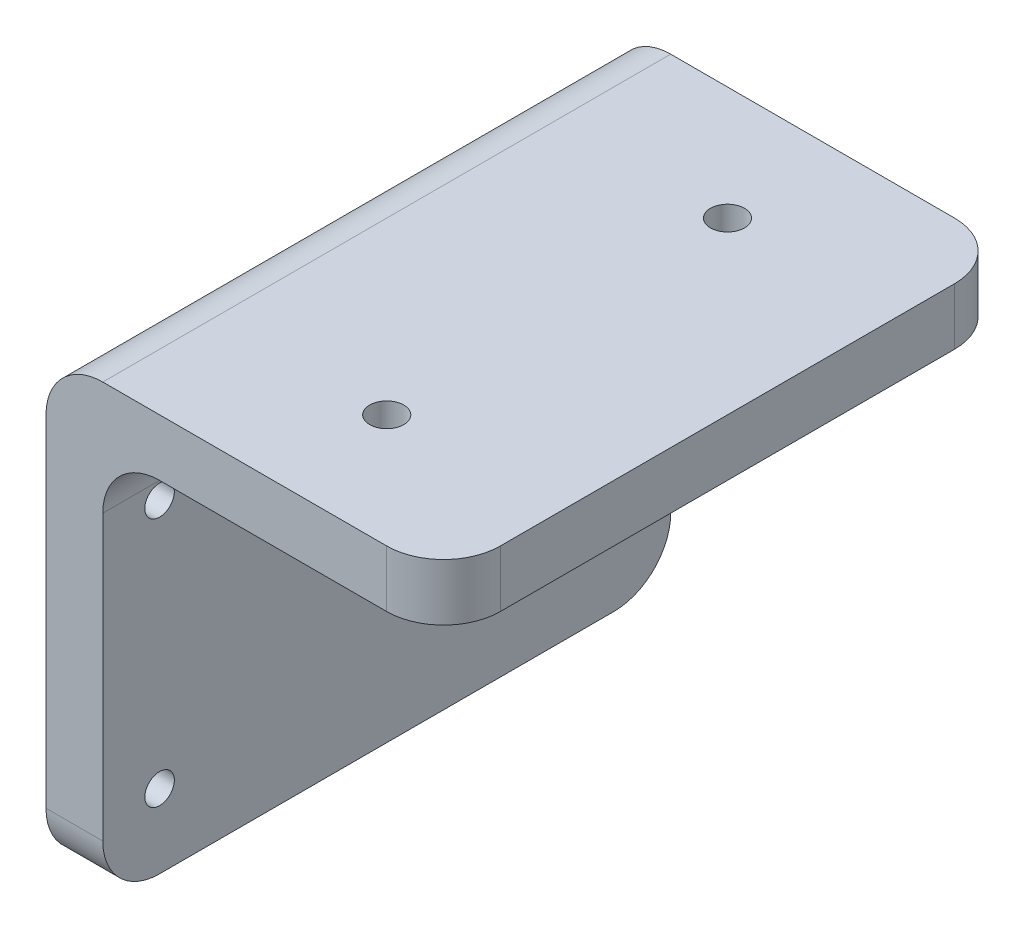
ISO-10303-21;
HEADER;
FILE_DESCRIPTION(('STEP AP214'),'2;1');
FILE_NAME('part.step','',(''),(''),'','','');
FILE_SCHEMA(('AUTOMOTIVE_DESIGN { 1 0 10303 214 1 1 1 1 }'));
ENDSEC;
DATA;
#1=APPLICATION_CONTEXT('core data for automotive mechanical design processes');
#2=APPLICATION_PROTOCOL_DEFINITION('international standard','automotive_design',2000,#1);
#3=PRODUCT_CONTEXT('',#1,'mechanical');
#4=PRODUCT('Part','Part','',(#3));
#5=PRODUCT_RELATED_PRODUCT_CATEGORY('part','',(#4));
#6=PRODUCT_DEFINITION_FORMATION('','',#4);
#7=PRODUCT_DEFINITION_CONTEXT('part definition',#1,'design');
#8=PRODUCT_DEFINITION('design','',#6,#7);
#9=PRODUCT_DEFINITION_SHAPE('','',#8);
#10=(LENGTH_UNIT() NAMED_UNIT(*) SI_UNIT(.MILLI.,.METRE.));
#11=(NAMED_UNIT(*) PLANE_ANGLE_UNIT() SI_UNIT($,.RADIAN.));
#12=(NAMED_UNIT(*) SI_UNIT($,.STERADIAN.) SOLID_ANGLE_UNIT());
#13=UNCERTAINTY_MEASURE_WITH_UNIT(LENGTH_MEASURE(1.E-05),#10,'distance_accuracy_value','');
#14=(GEOMETRIC_REPRESENTATION_CONTEXT(3) GLOBAL_UNCERTAINTY_ASSIGNED_CONTEXT((#13)) GLOBAL_UNIT_ASSIGNED_CONTEXT((#10,
#11,#12)) REPRESENTATION_CONTEXT('',''));
#15=CARTESIAN_POINT('',(0.,0.,0.));
#16=DIRECTION('',(0.,0.,1.));
#17=DIRECTION('',(1.,0.,0.));
#18=AXIS2_PLACEMENT_3D('',#15,#16,#17);
#19=CARTESIAN_POINT('',(15.,-5.,25.));
#20=DIRECTION('',(1.,0.,0.));
#21=DIRECTION('',(0.,0.,-1.));
#22=AXIS2_PLACEMENT_3D('',#19,#20,#21);
#23=PLANE('',#22);
#24=DIRECTION('',(0.,0.,-1.));
#25=VECTOR('',#24,1.);
#26=CARTESIAN_POINT('',(15.,-5.,25.));
#27=LINE('',#26,#25);
#28=CARTESIAN_POINT('',(15.,-5.,20.));
#29=VERTEX_POINT('',#28);
#30=CARTESIAN_POINT('',(15.,-5.,-20.));
#31=VERTEX_POINT('',#30);
#32=EDGE_CURVE('E246',#29,#31,#27,.T.);
#33=ORIENTED_EDGE('',*,*,#32,.T.);
#34=DIRECTION('',(0.,1.,0.));
#35=VECTOR('',#34,1.);
#36=CARTESIAN_POINT('',(15.,-5.,-20.));
#37=LINE('',#36,#35);
#38=CARTESIAN_POINT('',(15.,0.,-20.));
#39=VERTEX_POINT('',#38);
#40=EDGE_CURVE('E137',#31,#39,#37,.T.);
#41=ORIENTED_EDGE('',*,*,#40,.T.);
#42=DIRECTION('',(0.,0.,-1.));
#43=VECTOR('',#42,1.);
#44=CARTESIAN_POINT('',(15.,0.,25.));
#45=LINE('',#44,#43);
#46=CARTESIAN_POINT('',(15.,0.,20.));
#47=VERTEX_POINT('',#46);
#48=EDGE_CURVE('E129',#47,#39,#45,.T.);
#49=ORIENTED_EDGE('',*,*,#48,.F.);
#50=DIRECTION('',(0.,1.,0.));
#51=VECTOR('',#50,1.);
#52=CARTESIAN_POINT('',(15.,-5.,20.));
#53=LINE('',#52,#51);
#54=EDGE_CURVE('E142',#47,#29,#53,.F.);
#55=ORIENTED_EDGE('',*,*,#54,.T.);
#56=EDGE_LOOP('',(#33,#41,#49,#55));
#57=FACE_BOUND('',#56,.T.);
#58=ADVANCED_FACE('F34',(#57),#23,.T.);
#59=CARTESIAN_POINT('',(15.,-5.,25.));
#60=DIRECTION('',(0.,0.,1.));
#61=DIRECTION('',(1.,0.,0.));
#62=AXIS2_PLACEMENT_3D('',#59,#60,#61);
#63=PLANE('',#62);
#64=DIRECTION('',(1.,0.,0.));
#65=VECTOR('',#64,1.);
#66=CARTESIAN_POINT('',(15.,0.,25.));
#67=LINE('',#66,#65);
#68=CARTESIAN_POINT('',(-15.,0.,25.));
#69=VERTEX_POINT('',#68);
#70=CARTESIAN_POINT('',(10.,0.,25.));
#71=VERTEX_POINT('',#70);
#72=EDGE_CURVE('E131',#69,#71,#67,.T.);
#73=ORIENTED_EDGE('',*,*,#72,.F.);
#74=CARTESIAN_POINT('',(-15.,-5.,25.));
#75=DIRECTION('',(0.,0.,1.));
#76=DIRECTION('',(1.,0.,0.));
#77=AXIS2_PLACEMENT_3D('',#74,#75,#76);
#78=CIRCLE('',#77,5.);
#79=CARTESIAN_POINT('',(-20.,-5.,25.));
#80=VERTEX_POINT('',#79);
#81=EDGE_CURVE('E186',#69,#80,#78,.T.);
#82=ORIENTED_EDGE('',*,*,#81,.T.);
#83=DIRECTION('',(0.,1.,0.));
#84=VECTOR('',#83,1.);
#85=CARTESIAN_POINT('',(-20.,0.,25.));
#86=LINE('',#85,#84);
#87=CARTESIAN_POINT('',(-20.,-35.,25.));
#88=VERTEX_POINT('',#87);
#89=EDGE_CURVE('E231',#88,#80,#86,.T.);
#90=ORIENTED_EDGE('',*,*,#89,.F.);
#91=DIRECTION('',(1.,0.,0.));
#92=VECTOR('',#91,1.);
#93=CARTESIAN_POINT('',(-15.,-35.,25.));
#94=LINE('',#93,#92);
#95=CARTESIAN_POINT('',(-15.,-35.,25.));
#96=VERTEX_POINT('',#95);
#97=EDGE_CURVE('E181',#88,#96,#94,.T.);
#98=ORIENTED_EDGE('',*,*,#97,.T.);
#99=DIRECTION('',(0.,1.,0.));
#100=VECTOR('',#99,1.);
#101=CARTESIAN_POINT('',(-15.,0.,25.));
#102=LINE('',#101,#100);
#103=CARTESIAN_POINT('',(-15.,-10.,25.));
#104=VERTEX_POINT('',#103);
#105=EDGE_CURVE('E230',#96,#104,#102,.T.);
#106=ORIENTED_EDGE('',*,*,#105,.T.);
#107=CARTESIAN_POINT('',(-10.,-10.,25.));
#108=DIRECTION('',(0.,0.,1.));
#109=DIRECTION('',(1.,0.,0.));
#110=AXIS2_PLACEMENT_3D('',#107,#108,#109);
#111=CIRCLE('',#110,5.);
#112=CARTESIAN_POINT('',(-10.,-5.,25.));
#113=VERTEX_POINT('',#112);
#114=EDGE_CURVE('E43',#104,#113,#111,.F.);
#115=ORIENTED_EDGE('',*,*,#114,.T.);
#116=DIRECTION('',(1.,0.,0.));
#117=VECTOR('',#116,1.);
#118=CARTESIAN_POINT('',(15.,-5.,25.));
#119=LINE('',#118,#117);
#120=CARTESIAN_POINT('',(10.,-5.,25.));
#121=VERTEX_POINT('',#120);
#122=EDGE_CURVE('E151',#113,#121,#119,.T.);
#123=ORIENTED_EDGE('',*,*,#122,.T.);
#124=DIRECTION('',(0.,1.,0.));
#125=VECTOR('',#124,1.);
#126=CARTESIAN_POINT('',(10.,-5.,25.));
#127=LINE('',#126,#125);
#128=EDGE_CURVE('E184',#121,#71,#127,.T.);
#129=ORIENTED_EDGE('',*,*,#128,.T.);
#130=EDGE_LOOP('',(#73,#82,#90,#98,#106,#115,#123,#129));
#131=FACE_BOUND('',#130,.T.);
#132=ADVANCED_FACE('F260',(#131),#63,.T.);
#133=CARTESIAN_POINT('',(15.,-5.,-25.));
#134=DIRECTION('',(0.,0.,-1.));
#135=DIRECTION('',(-1.,0.,0.));
#136=AXIS2_PLACEMENT_3D('',#133,#134,#135);
#137=PLANE('',#136);
#138=DIRECTION('',(-1.,0.,0.));
#139=VECTOR('',#138,1.);
#140=CARTESIAN_POINT('',(15.,0.,-25.));
#141=LINE('',#140,#139);
#142=CARTESIAN_POINT('',(10.,0.,-25.));
#143=VERTEX_POINT('',#142);
#144=CARTESIAN_POINT('',(-15.,0.,-25.));
#145=VERTEX_POINT('',#144);
#146=EDGE_CURVE('E145',#143,#145,#141,.T.);
#147=ORIENTED_EDGE('',*,*,#146,.F.);
#148=DIRECTION('',(0.,1.,0.));
#149=VECTOR('',#148,1.);
#150=CARTESIAN_POINT('',(10.,-5.,-25.));
#151=LINE('',#150,#149);
#152=CARTESIAN_POINT('',(10.,-5.,-25.));
#153=VERTEX_POINT('',#152);
#154=EDGE_CURVE('E167',#143,#153,#151,.F.);
#155=ORIENTED_EDGE('',*,*,#154,.T.);
#156=DIRECTION('',(-1.,0.,0.));
#157=VECTOR('',#156,1.);
#158=CARTESIAN_POINT('',(15.,-5.,-25.));
#159=LINE('',#158,#157);
#160=CARTESIAN_POINT('',(-10.,-5.,-25.));
#161=VERTEX_POINT('',#160);
#162=EDGE_CURVE('E155',#153,#161,#159,.T.);
#163=ORIENTED_EDGE('',*,*,#162,.T.);
#164=CARTESIAN_POINT('',(-10.,-10.,-25.));
#165=DIRECTION('',(0.,0.,-1.));
#166=DIRECTION('',(-1.,0.,0.));
#167=AXIS2_PLACEMENT_3D('',#164,#165,#166);
#168=CIRCLE('',#167,5.);
#169=CARTESIAN_POINT('',(-15.,-10.,-25.));
#170=VERTEX_POINT('',#169);
#171=EDGE_CURVE('E11',#161,#170,#168,.F.);
#172=ORIENTED_EDGE('',*,*,#171,.T.);
#173=DIRECTION('',(0.,-1.,0.));
#174=VECTOR('',#173,1.);
#175=CARTESIAN_POINT('',(-15.,0.,-25.));
#176=LINE('',#175,#174);
#177=CARTESIAN_POINT('',(-15.,-35.,-25.));
#178=VERTEX_POINT('',#177);
#179=EDGE_CURVE('E242',#170,#178,#176,.T.);
#180=ORIENTED_EDGE('',*,*,#179,.T.);
#181=DIRECTION('',(1.,0.,0.));
#182=VECTOR('',#181,1.);
#183=CARTESIAN_POINT('',(-20.,-35.,-25.));
#184=LINE('',#183,#182);
#185=CARTESIAN_POINT('',(-20.,-35.,-25.));
#186=VERTEX_POINT('',#185);
#187=EDGE_CURVE('E163',#178,#186,#184,.F.);
#188=ORIENTED_EDGE('',*,*,#187,.T.);
#189=DIRECTION('',(0.,-1.,0.));
#190=VECTOR('',#189,1.);
#191=CARTESIAN_POINT('',(-20.,0.,-25.));
#192=LINE('',#191,#190);
#193=CARTESIAN_POINT('',(-20.,-5.,-25.));
#194=VERTEX_POINT('',#193);
#195=EDGE_CURVE('E234',#194,#186,#192,.T.);
#196=ORIENTED_EDGE('',*,*,#195,.F.);
#197=CARTESIAN_POINT('',(-15.,-5.,-25.));
#198=DIRECTION('',(0.,0.,-1.));
#199=DIRECTION('',(-1.,0.,0.));
#200=AXIS2_PLACEMENT_3D('',#197,#198,#199);
#201=CIRCLE('',#200,5.);
#202=EDGE_CURVE('E165',#194,#145,#201,.T.);
#203=ORIENTED_EDGE('',*,*,#202,.T.);
#204=EDGE_LOOP('',(#147,#155,#163,#172,#180,#188,#196,#203));
#205=FACE_BOUND('',#204,.T.);
#206=ADVANCED_FACE('F283',(#205),#137,.T.);
#207=CARTESIAN_POINT('',(0.,-5.,0.));
#208=DIRECTION('',(0.,1.,0.));
#209=DIRECTION('',(0.,0.,1.));
#210=AXIS2_PLACEMENT_3D('',#207,#208,#209);
#211=PLANE('',#210);
#212=CARTESIAN_POINT('',(0.,-5.,-15.));
#213=DIRECTION('',(0.,1.,0.));
#214=DIRECTION('',(0.,0.,1.));
#215=AXIS2_PLACEMENT_3D('',#212,#213,#214);
#216=CIRCLE('',#215,1.5);
#217=CARTESIAN_POINT('',(0.,-5.,-13.5));
#218=VERTEX_POINT('',#217);
#219=EDGE_CURVE('E227',#218,#218,#216,.T.);
#220=ORIENTED_EDGE('',*,*,#219,.T.);
#221=EDGE_LOOP('',(#220));
#222=FACE_BOUND('',#221,.T.);
#223=CARTESIAN_POINT('',(0.,-5.,15.));
#224=DIRECTION('',(0.,1.,0.));
#225=DIRECTION('',(0.,0.,1.));
#226=AXIS2_PLACEMENT_3D('',#223,#224,#225);
#227=CIRCLE('',#226,1.5);
#228=CARTESIAN_POINT('',(0.,-5.,16.5));
#229=VERTEX_POINT('',#228);
#230=EDGE_CURVE('E221',#229,#229,#227,.T.);
#231=ORIENTED_EDGE('',*,*,#230,.T.);
#232=EDGE_LOOP('',(#231));
#233=FACE_BOUND('',#232,.T.);
#234=ORIENTED_EDGE('',*,*,#162,.F.);
#235=CARTESIAN_POINT('',(10.,-5.,-20.));
#236=DIRECTION('',(0.,1.,0.));
#237=DIRECTION('',(0.,0.,1.));
#238=AXIS2_PLACEMENT_3D('',#235,#236,#237);
#239=CIRCLE('',#238,5.);
#240=EDGE_CURVE('E172',#153,#31,#239,.F.);
#241=ORIENTED_EDGE('',*,*,#240,.T.);
#242=ORIENTED_EDGE('',*,*,#32,.F.);
#243=CARTESIAN_POINT('',(10.,-5.,20.));
#244=DIRECTION('',(0.,1.,0.));
#245=DIRECTION('',(0.,0.,1.));
#246=AXIS2_PLACEMENT_3D('',#243,#244,#245);
#247=CIRCLE('',#246,5.);
#248=EDGE_CURVE('E150',#29,#121,#247,.F.);
#249=ORIENTED_EDGE('',*,*,#248,.T.);
#250=ORIENTED_EDGE('',*,*,#122,.F.);
#251=DIRECTION('',(0.,0.,1.));
#252=VECTOR('',#251,1.);
#253=CARTESIAN_POINT('',(-10.,-5.,0.));
#254=LINE('',#253,#252);
#255=EDGE_CURVE('E169',#113,#161,#254,.F.);
#256=ORIENTED_EDGE('',*,*,#255,.T.);
#257=EDGE_LOOP('',(#234,#241,#242,#249,#250,#256));
#258=FACE_BOUND('',#257,.T.);
#259=ADVANCED_FACE('F279',(#222,#233,#258),#211,.F.);
#260=CARTESIAN_POINT('',(0.,0.,0.));
#261=DIRECTION('',(0.,1.,0.));
#262=DIRECTION('',(0.,0.,1.));
#263=AXIS2_PLACEMENT_3D('',#260,#261,#262);
#264=PLANE('',#263);
#265=CARTESIAN_POINT('',(0.,0.,-15.));
#266=DIRECTION('',(0.,1.,0.));
#267=DIRECTION('',(0.,0.,1.));
#268=AXIS2_PLACEMENT_3D('',#265,#266,#267);
#269=CIRCLE('',#268,1.5);
#270=CARTESIAN_POINT('',(0.,0.,-13.5));
#271=VERTEX_POINT('',#270);
#272=EDGE_CURVE('E216',#271,#271,#269,.T.);
#273=ORIENTED_EDGE('',*,*,#272,.F.);
#274=EDGE_LOOP('',(#273));
#275=FACE_BOUND('',#274,.T.);
#276=CARTESIAN_POINT('',(0.,0.,15.));
#277=DIRECTION('',(0.,1.,0.));
#278=DIRECTION('',(0.,0.,1.));
#279=AXIS2_PLACEMENT_3D('',#276,#277,#278);
#280=CIRCLE('',#279,1.5);
#281=CARTESIAN_POINT('',(0.,0.,16.5));
#282=VERTEX_POINT('',#281);
#283=EDGE_CURVE('E212',#282,#282,#280,.T.);
#284=ORIENTED_EDGE('',*,*,#283,.F.);
#285=EDGE_LOOP('',(#284));
#286=FACE_BOUND('',#285,.T.);
#287=ORIENTED_EDGE('',*,*,#48,.T.);
#288=CARTESIAN_POINT('',(10.,0.,-20.));
#289=DIRECTION('',(0.,1.,0.));
#290=DIRECTION('',(0.,0.,1.));
#291=AXIS2_PLACEMENT_3D('',#288,#289,#290);
#292=CIRCLE('',#291,5.);
#293=EDGE_CURVE('E161',#39,#143,#292,.T.);
#294=ORIENTED_EDGE('',*,*,#293,.T.);
#295=ORIENTED_EDGE('',*,*,#146,.T.);
#296=DIRECTION('',(0.,0.,-1.));
#297=VECTOR('',#296,1.);
#298=CARTESIAN_POINT('',(-15.,0.,25.));
#299=LINE('',#298,#297);
#300=EDGE_CURVE('E136',#145,#69,#299,.F.);
#301=ORIENTED_EDGE('',*,*,#300,.T.);
#302=ORIENTED_EDGE('',*,*,#72,.T.);
#303=CARTESIAN_POINT('',(10.,0.,20.));
#304=DIRECTION('',(0.,1.,0.));
#305=DIRECTION('',(0.,0.,1.));
#306=AXIS2_PLACEMENT_3D('',#303,#304,#305);
#307=CIRCLE('',#306,5.);
#308=EDGE_CURVE('E126',#71,#47,#307,.T.);
#309=ORIENTED_EDGE('',*,*,#308,.T.);
#310=EDGE_LOOP('',(#287,#294,#295,#301,#302,#309));
#311=FACE_BOUND('',#310,.T.);
#312=ADVANCED_FACE('F128',(#275,#286,#311),#264,.T.);
#313=CARTESIAN_POINT('',(-20.,-40.,25.));
#314=DIRECTION('',(0.,1.,0.));
#315=DIRECTION('',(0.,0.,1.));
#316=AXIS2_PLACEMENT_3D('',#313,#314,#315);
#317=PLANE('',#316);
#318=DIRECTION('',(0.,0.,1.));
#319=VECTOR('',#318,1.);
#320=CARTESIAN_POINT('',(-20.,-40.,25.));
#321=LINE('',#320,#319);
#322=CARTESIAN_POINT('',(-20.,-40.,-20.));
#323=VERTEX_POINT('',#322);
#324=CARTESIAN_POINT('',(-20.,-40.,20.));
#325=VERTEX_POINT('',#324);
#326=EDGE_CURVE('E146',#323,#325,#321,.T.);
#327=ORIENTED_EDGE('',*,*,#326,.F.);
#328=DIRECTION('',(1.,0.,0.));
#329=VECTOR('',#328,1.);
#330=CARTESIAN_POINT('',(-15.,-40.,-20.));
#331=LINE('',#330,#329);
#332=CARTESIAN_POINT('',(-15.,-40.,-20.));
#333=VERTEX_POINT('',#332);
#334=EDGE_CURVE('E190',#323,#333,#331,.T.);
#335=ORIENTED_EDGE('',*,*,#334,.T.);
#336=DIRECTION('',(0.,0.,1.));
#337=VECTOR('',#336,1.);
#338=CARTESIAN_POINT('',(-15.,-40.,25.));
#339=LINE('',#338,#337);
#340=CARTESIAN_POINT('',(-15.,-40.,20.));
#341=VERTEX_POINT('',#340);
#342=EDGE_CURVE('E235',#333,#341,#339,.T.);
#343=ORIENTED_EDGE('',*,*,#342,.T.);
#344=DIRECTION('',(1.,0.,0.));
#345=VECTOR('',#344,1.);
#346=CARTESIAN_POINT('',(-20.,-40.,20.));
#347=LINE('',#346,#345);
#348=EDGE_CURVE('E188',#341,#325,#347,.F.);
#349=ORIENTED_EDGE('',*,*,#348,.T.);
#350=EDGE_LOOP('',(#327,#335,#343,#349));
#351=FACE_BOUND('',#350,.T.);
#352=ADVANCED_FACE('F287',(#351),#317,.F.);
#353=CARTESIAN_POINT('',(-20.,0.,0.));
#354=DIRECTION('',(1.,0.,0.));
#355=DIRECTION('',(0.,0.,-1.));
#356=AXIS2_PLACEMENT_3D('',#353,#354,#355);
#357=PLANE('',#356);
#358=CARTESIAN_POINT('',(-20.,-11.5,20.));
#359=DIRECTION('',(-1.,0.,0.));
#360=DIRECTION('',(0.,0.,1.));
#361=AXIS2_PLACEMENT_3D('',#358,#359,#360);
#362=CIRCLE('',#361,1.3);
#363=CARTESIAN_POINT('',(-20.,-11.5,21.3));
#364=VERTEX_POINT('',#363);
#365=EDGE_CURVE('E356',#364,#364,#362,.T.);
#366=ORIENTED_EDGE('',*,*,#365,.F.);
#367=EDGE_LOOP('',(#366));
#368=FACE_BOUND('',#367,.T.);
#369=CARTESIAN_POINT('',(-20.,-33.5,20.));
#370=DIRECTION('',(-1.,0.,0.));
#371=DIRECTION('',(0.,0.,1.));
#372=AXIS2_PLACEMENT_3D('',#369,#370,#371);
#373=CIRCLE('',#372,1.3);
#374=CARTESIAN_POINT('',(-20.,-33.5,21.3));
#375=VERTEX_POINT('',#374);
#376=EDGE_CURVE('E359',#375,#375,#373,.T.);
#377=ORIENTED_EDGE('',*,*,#376,.F.);
#378=EDGE_LOOP('',(#377));
#379=FACE_BOUND('',#378,.T.);
#380=CARTESIAN_POINT('',(-20.,-33.5,-20.));
#381=DIRECTION('',(-1.,0.,0.));
#382=DIRECTION('',(0.,0.,1.));
#383=AXIS2_PLACEMENT_3D('',#380,#381,#382);
#384=CIRCLE('',#383,1.29999999999999);
#385=CARTESIAN_POINT('',(-20.,-33.5,-18.7));
#386=VERTEX_POINT('',#385);
#387=EDGE_CURVE('E353',#386,#386,#384,.T.);
#388=ORIENTED_EDGE('',*,*,#387,.F.);
#389=EDGE_LOOP('',(#388));
#390=FACE_BOUND('',#389,.T.);
#391=CARTESIAN_POINT('',(-20.,-11.5,-20.));
#392=DIRECTION('',(-1.,0.,0.));
#393=DIRECTION('',(0.,0.,1.));
#394=AXIS2_PLACEMENT_3D('',#391,#392,#393);
#395=CIRCLE('',#394,1.29999999999999);
#396=CARTESIAN_POINT('',(-20.,-11.5,-18.7));
#397=VERTEX_POINT('',#396);
#398=EDGE_CURVE('E351',#397,#397,#395,.T.);
#399=ORIENTED_EDGE('',*,*,#398,.F.);
#400=EDGE_LOOP('',(#399));
#401=FACE_BOUND('',#400,.T.);
#402=CARTESIAN_POINT('',(-20.,-22.5,-12.));
#403=DIRECTION('',(-1.,0.,0.));
#404=DIRECTION('',(0.,0.,1.));
#405=AXIS2_PLACEMENT_3D('',#402,#403,#404);
#406=CIRCLE('',#405,10.25);
#407=CARTESIAN_POINT('',(-20.,-22.5,-1.75));
#408=VERTEX_POINT('',#407);
#409=EDGE_CURVE('E202',#408,#408,#406,.T.);
#410=ORIENTED_EDGE('',*,*,#409,.F.);
#411=EDGE_LOOP('',(#410));
#412=FACE_BOUND('',#411,.T.);
#413=ORIENTED_EDGE('',*,*,#89,.T.);
#414=DIRECTION('',(0.,0.,-1.));
#415=VECTOR('',#414,1.);
#416=CARTESIAN_POINT('',(-20.,-5.,-25.));
#417=LINE('',#416,#415);
#418=EDGE_CURVE('E178',#80,#194,#417,.T.);
#419=ORIENTED_EDGE('',*,*,#418,.T.);
#420=ORIENTED_EDGE('',*,*,#195,.T.);
#421=CARTESIAN_POINT('',(-20.,-35.,-20.));
#422=DIRECTION('',(1.,0.,0.));
#423=DIRECTION('',(0.,0.,-1.));
#424=AXIS2_PLACEMENT_3D('',#421,#422,#423);
#425=CIRCLE('',#424,5.);
#426=EDGE_CURVE('E176',#186,#323,#425,.F.);
#427=ORIENTED_EDGE('',*,*,#426,.T.);
#428=ORIENTED_EDGE('',*,*,#326,.T.);
#429=CARTESIAN_POINT('',(-20.,-35.,20.));
#430=DIRECTION('',(1.,0.,0.));
#431=DIRECTION('',(0.,0.,-1.));
#432=AXIS2_PLACEMENT_3D('',#429,#430,#431);
#433=CIRCLE('',#432,5.);
#434=EDGE_CURVE('E174',#325,#88,#433,.F.);
#435=ORIENTED_EDGE('',*,*,#434,.T.);
#436=EDGE_LOOP('',(#413,#419,#420,#427,#428,#435));
#437=FACE_BOUND('',#436,.T.);
#438=ADVANCED_FACE('F263',(#368,#379,#390,#401,#412,#437),#357,.F.);
#439=CARTESIAN_POINT('',(-15.,0.,0.));
#440=DIRECTION('',(1.,0.,0.));
#441=DIRECTION('',(0.,0.,-1.));
#442=AXIS2_PLACEMENT_3D('',#439,#440,#441);
#443=PLANE('',#442);
#444=CARTESIAN_POINT('',(-15.,-11.5,20.));
#445=DIRECTION('',(1.,0.,0.));
#446=DIRECTION('',(0.,0.,-1.));
#447=AXIS2_PLACEMENT_3D('',#444,#445,#446);
#448=CIRCLE('',#447,1.3);
#449=CARTESIAN_POINT('',(-15.,-11.5,18.7));
#450=VERTEX_POINT('',#449);
#451=EDGE_CURVE('E38',#450,#450,#448,.T.);
#452=ORIENTED_EDGE('',*,*,#451,.F.);
#453=EDGE_LOOP('',(#452));
#454=FACE_BOUND('',#453,.T.);
#455=CARTESIAN_POINT('',(-15.,-33.5,20.));
#456=DIRECTION('',(1.,0.,0.));
#457=DIRECTION('',(0.,0.,-1.));
#458=AXIS2_PLACEMENT_3D('',#455,#456,#457);
#459=CIRCLE('',#458,1.3);
#460=CARTESIAN_POINT('',(-15.,-33.5,18.7));
#461=VERTEX_POINT('',#460);
#462=EDGE_CURVE('E207',#461,#461,#459,.T.);
#463=ORIENTED_EDGE('',*,*,#462,.F.);
#464=EDGE_LOOP('',(#463));
#465=FACE_BOUND('',#464,.T.);
#466=CARTESIAN_POINT('',(-15.,-33.5,-20.));
#467=DIRECTION('',(1.,0.,0.));
#468=DIRECTION('',(0.,0.,-1.));
#469=AXIS2_PLACEMENT_3D('',#466,#467,#468);
#470=CIRCLE('',#469,1.29999999999999);
#471=CARTESIAN_POINT('',(-15.,-33.5,-21.3));
#472=VERTEX_POINT('',#471);
#473=EDGE_CURVE('E205',#472,#472,#470,.T.);
#474=ORIENTED_EDGE('',*,*,#473,.F.);
#475=EDGE_LOOP('',(#474));
#476=FACE_BOUND('',#475,.T.);
#477=CARTESIAN_POINT('',(-15.,-11.5,-20.));
#478=DIRECTION('',(1.,0.,0.));
#479=DIRECTION('',(0.,0.,-1.));
#480=AXIS2_PLACEMENT_3D('',#477,#478,#479);
#481=CIRCLE('',#480,1.29999999999999);
#482=CARTESIAN_POINT('',(-15.,-11.5,-21.3));
#483=VERTEX_POINT('',#482);
#484=EDGE_CURVE('E201',#483,#483,#481,.T.);
#485=ORIENTED_EDGE('',*,*,#484,.F.);
#486=EDGE_LOOP('',(#485));
#487=FACE_BOUND('',#486,.T.);
#488=CARTESIAN_POINT('',(-15.,-22.5,-12.));
#489=DIRECTION('',(1.,0.,0.));
#490=DIRECTION('',(0.,0.,-1.));
#491=AXIS2_PLACEMENT_3D('',#488,#489,#490);
#492=CIRCLE('',#491,10.25);
#493=CARTESIAN_POINT('',(-15.,-22.5,-22.25));
#494=VERTEX_POINT('',#493);
#495=EDGE_CURVE('E198',#494,#494,#492,.T.);
#496=ORIENTED_EDGE('',*,*,#495,.F.);
#497=EDGE_LOOP('',(#496));
#498=FACE_BOUND('',#497,.T.);
#499=ORIENTED_EDGE('',*,*,#342,.F.);
#500=CARTESIAN_POINT('',(-15.,-35.,-20.));
#501=DIRECTION('',(1.,0.,0.));
#502=DIRECTION('',(0.,0.,-1.));
#503=AXIS2_PLACEMENT_3D('',#500,#501,#502);
#504=CIRCLE('',#503,5.);
#505=EDGE_CURVE('E59',#333,#178,#504,.T.);
#506=ORIENTED_EDGE('',*,*,#505,.T.);
#507=ORIENTED_EDGE('',*,*,#179,.F.);
#508=DIRECTION('',(0.,0.,1.));
#509=VECTOR('',#508,1.);
#510=CARTESIAN_POINT('',(-15.,-10.,0.));
#511=LINE('',#510,#509);
#512=EDGE_CURVE('E192',#170,#104,#511,.T.);
#513=ORIENTED_EDGE('',*,*,#512,.T.);
#514=ORIENTED_EDGE('',*,*,#105,.F.);
#515=CARTESIAN_POINT('',(-15.,-35.,20.));
#516=DIRECTION('',(1.,0.,0.));
#517=DIRECTION('',(0.,0.,-1.));
#518=AXIS2_PLACEMENT_3D('',#515,#516,#517);
#519=CIRCLE('',#518,5.);
#520=EDGE_CURVE('E51',#96,#341,#519,.T.);
#521=ORIENTED_EDGE('',*,*,#520,.T.);
#522=EDGE_LOOP('',(#499,#506,#507,#513,#514,#521));
#523=FACE_BOUND('',#522,.T.);
#524=ADVANCED_FACE('F270',(#454,#465,#476,#487,#498,#523),#443,.T.);
#525=CARTESIAN_POINT('',(10.,-5.,-20.));
#526=DIRECTION('',(0.,1.,0.));
#527=DIRECTION('',(0.,0.,1.));
#528=AXIS2_PLACEMENT_3D('',#525,#526,#527);
#529=CYLINDRICAL_SURFACE('',#528,5.);
#530=ORIENTED_EDGE('',*,*,#240,.F.);
#531=ORIENTED_EDGE('',*,*,#154,.F.);
#532=ORIENTED_EDGE('',*,*,#293,.F.);
#533=ORIENTED_EDGE('',*,*,#40,.F.);
#534=EDGE_LOOP('',(#530,#531,#532,#533));
#535=FACE_BOUND('',#534,.T.);
#536=ADVANCED_FACE('F282',(#535),#529,.T.);
#537=CARTESIAN_POINT('',(-15.,-5.,0.));
#538=DIRECTION('',(0.,0.,1.));
#539=DIRECTION('',(1.,0.,0.));
#540=AXIS2_PLACEMENT_3D('',#537,#538,#539);
#541=CYLINDRICAL_SURFACE('',#540,5.);
#542=ORIENTED_EDGE('',*,*,#81,.F.);
#543=ORIENTED_EDGE('',*,*,#300,.F.);
#544=ORIENTED_EDGE('',*,*,#202,.F.);
#545=ORIENTED_EDGE('',*,*,#418,.F.);
#546=EDGE_LOOP('',(#542,#543,#544,#545));
#547=FACE_BOUND('',#546,.T.);
#548=ADVANCED_FACE('F256',(#547),#541,.T.);
#549=CARTESIAN_POINT('',(-20.,-35.,-20.));
#550=DIRECTION('',(-1.,0.,0.));
#551=DIRECTION('',(0.,-1.,0.));
#552=AXIS2_PLACEMENT_3D('',#549,#550,#551);
#553=CYLINDRICAL_SURFACE('',#552,5.);
#554=ORIENTED_EDGE('',*,*,#426,.F.);
#555=ORIENTED_EDGE('',*,*,#187,.F.);
#556=ORIENTED_EDGE('',*,*,#505,.F.);
#557=ORIENTED_EDGE('',*,*,#334,.F.);
#558=EDGE_LOOP('',(#554,#555,#556,#557));
#559=FACE_BOUND('',#558,.T.);
#560=ADVANCED_FACE('F285',(#559),#553,.T.);
#561=CARTESIAN_POINT('',(10.,-5.,20.));
#562=DIRECTION('',(0.,1.,0.));
#563=DIRECTION('',(0.,0.,1.));
#564=AXIS2_PLACEMENT_3D('',#561,#562,#563);
#565=CYLINDRICAL_SURFACE('',#564,5.);
#566=ORIENTED_EDGE('',*,*,#248,.F.);
#567=ORIENTED_EDGE('',*,*,#54,.F.);
#568=ORIENTED_EDGE('',*,*,#308,.F.);
#569=ORIENTED_EDGE('',*,*,#128,.F.);
#570=EDGE_LOOP('',(#566,#567,#568,#569));
#571=FACE_BOUND('',#570,.T.);
#572=ADVANCED_FACE('F149',(#571),#565,.T.);
#573=CARTESIAN_POINT('',(15.,-35.,20.));
#574=DIRECTION('',(-1.,0.,0.));
#575=DIRECTION('',(0.,-1.,0.));
#576=AXIS2_PLACEMENT_3D('',#573,#574,#575);
#577=CYLINDRICAL_SURFACE('',#576,5.);
#578=ORIENTED_EDGE('',*,*,#434,.F.);
#579=ORIENTED_EDGE('',*,*,#348,.F.);
#580=ORIENTED_EDGE('',*,*,#520,.F.);
#581=ORIENTED_EDGE('',*,*,#97,.F.);
#582=EDGE_LOOP('',(#578,#579,#580,#581));
#583=FACE_BOUND('',#582,.T.);
#584=ADVANCED_FACE('F269',(#583),#577,.T.);
#585=CARTESIAN_POINT('',(-10.,-10.,0.));
#586=DIRECTION('',(0.,0.,1.));
#587=DIRECTION('',(1.,0.,0.));
#588=AXIS2_PLACEMENT_3D('',#585,#586,#587);
#589=CYLINDRICAL_SURFACE('',#588,5.);
#590=ORIENTED_EDGE('',*,*,#171,.F.);
#591=ORIENTED_EDGE('',*,*,#255,.F.);
#592=ORIENTED_EDGE('',*,*,#114,.F.);
#593=ORIENTED_EDGE('',*,*,#512,.F.);
#594=EDGE_LOOP('',(#590,#591,#592,#593));
#595=FACE_BOUND('',#594,.T.);
#596=ADVANCED_FACE('F36',(#595),#589,.F.);
#597=CARTESIAN_POINT('',(0.,-40.,15.));
#598=DIRECTION('',(0.,1.,0.));
#599=DIRECTION('',(0.,0.,1.));
#600=AXIS2_PLACEMENT_3D('',#597,#598,#599);
#601=CYLINDRICAL_SURFACE('',#600,1.5);
#602=CARTESIAN_POINT('',(0.,0.,16.5));
#603=CARTESIAN_POINT('',(0.,-0.0520833333333322,16.5));
#604=CARTESIAN_POINT('',(0.,-0.104166666666664,16.5));
#605=CARTESIAN_POINT('',(0.,-0.208333333333331,16.5));
#606=CARTESIAN_POINT('',(0.,-0.260416666666666,16.5));
#607=CARTESIAN_POINT('',(0.,-0.364583333333335,16.5));
#608=CARTESIAN_POINT('',(0.,-0.416666666666669,16.5));
#609=CARTESIAN_POINT('',(0.,-0.520833333333336,16.5));
#610=CARTESIAN_POINT('',(0.,-0.572916666666668,16.5));
#611=CARTESIAN_POINT('',(0.,-0.677083333333333,16.5));
#612=CARTESIAN_POINT('',(0.,-0.729166666666665,16.5));
#613=CARTESIAN_POINT('',(0.,-0.833333333333332,16.5));
#614=CARTESIAN_POINT('',(0.,-0.885416666666666,16.5));
#615=CARTESIAN_POINT('',(0.,-0.989583333333335,16.5));
#616=CARTESIAN_POINT('',(0.,-1.04166666666667,16.5));
#617=CARTESIAN_POINT('',(0.,-1.14583333333334,16.5));
#618=CARTESIAN_POINT('',(0.,-1.19791666666667,16.5));
#619=CARTESIAN_POINT('',(0.,-1.30208333333333,16.5));
#620=CARTESIAN_POINT('',(0.,-1.35416666666667,16.5));
#621=CARTESIAN_POINT('',(0.,-1.45833333333333,16.5));
#622=CARTESIAN_POINT('',(0.,-1.51041666666667,16.5));
#623=CARTESIAN_POINT('',(0.,-1.61458333333334,16.5));
#624=CARTESIAN_POINT('',(0.,-1.66666666666667,16.5));
#625=CARTESIAN_POINT('',(0.,-1.77083333333334,16.5));
#626=CARTESIAN_POINT('',(0.,-1.82291666666667,16.5));
#627=CARTESIAN_POINT('',(0.,-1.92708333333333,16.5));
#628=CARTESIAN_POINT('',(0.,-1.97916666666667,16.5));
#629=CARTESIAN_POINT('',(0.,-2.08333333333333,16.5));
#630=CARTESIAN_POINT('',(0.,-2.13541666666667,16.5));
#631=CARTESIAN_POINT('',(0.,-2.23958333333334,16.5));
#632=CARTESIAN_POINT('',(0.,-2.29166666666667,16.5));
#633=CARTESIAN_POINT('',(0.,-2.39583333333334,16.5));
#634=CARTESIAN_POINT('',(0.,-2.44791666666667,16.5));
#635=CARTESIAN_POINT('',(0.,-2.55208333333333,16.5));
#636=CARTESIAN_POINT('',(0.,-2.60416666666667,16.5));
#637=CARTESIAN_POINT('',(0.,-2.70833333333333,16.5));
#638=CARTESIAN_POINT('',(0.,-2.76041666666667,16.5));
#639=CARTESIAN_POINT('',(0.,-2.86458333333334,16.5));
#640=CARTESIAN_POINT('',(0.,-2.91666666666667,16.5));
#641=CARTESIAN_POINT('',(0.,-3.02083333333334,16.5));
#642=CARTESIAN_POINT('',(0.,-3.07291666666667,16.5));
#643=CARTESIAN_POINT('',(0.,-3.17708333333334,16.5));
#644=CARTESIAN_POINT('',(0.,-3.22916666666667,16.5));
#645=CARTESIAN_POINT('',(0.,-3.33333333333333,16.5));
#646=CARTESIAN_POINT('',(0.,-3.38541666666667,16.5));
#647=CARTESIAN_POINT('',(0.,-3.48958333333334,16.5));
#648=CARTESIAN_POINT('',(0.,-3.54166666666667,16.5));
#649=CARTESIAN_POINT('',(0.,-3.64583333333334,16.5));
#650=CARTESIAN_POINT('',(0.,-3.69791666666667,16.5));
#651=CARTESIAN_POINT('',(0.,-3.80208333333334,16.5));
#652=CARTESIAN_POINT('',(0.,-3.85416666666667,16.5));
#653=CARTESIAN_POINT('',(0.,-3.95833333333333,16.5));
#654=CARTESIAN_POINT('',(0.,-4.01041666666667,16.5));
#655=CARTESIAN_POINT('',(0.,-4.11458333333334,16.5));
#656=CARTESIAN_POINT('',(0.,-4.16666666666667,16.5));
#657=CARTESIAN_POINT('',(0.,-4.27083333333334,16.5));
#658=CARTESIAN_POINT('',(0.,-4.32291666666667,16.5));
#659=CARTESIAN_POINT('',(0.,-4.42708333333334,16.5));
#660=CARTESIAN_POINT('',(0.,-4.47916666666667,16.5));
#661=CARTESIAN_POINT('',(0.,-4.58333333333333,16.5));
#662=CARTESIAN_POINT('',(0.,-4.63541666666667,16.5));
#663=CARTESIAN_POINT('',(0.,-4.73958333333334,16.5));
#664=CARTESIAN_POINT('',(0.,-4.79166666666667,16.5));
#665=CARTESIAN_POINT('',(0.,-4.89583333333334,16.5));
#666=CARTESIAN_POINT('',(0.,-4.94791666666667,16.5));
#667=CARTESIAN_POINT('',(0.,-5.,16.5));
#668=B_SPLINE_CURVE_WITH_KNOTS('',3,(#602,#603,#604,#605,#606,#607,#608,#609,#610,#611,#612,
#613,#614,#615,#616,#617,#618,#619,#620,#621,#622,#623,#624,#625,#626,#627,#628,#629,#630,#631,
#632,#633,#634,#635,#636,#637,#638,#639,#640,#641,#642,#643,#644,#645,#646,#647,#648,#649,#650,
#651,#652,#653,#654,#655,#656,#657,#658,#659,#660,#661,#662,#663,#664,#665,#666,#667),
.UNSPECIFIED.,.F.,.F.,(4,2,2,2,2,2,2,2,2,2,2,2,2,2,2,2,2,2,2,2,2,2,2,2,2,2,2,2,2,2,2,2,4),(0.,
0.156249999999997,0.3125,0.468750000000004,0.625000000000001,0.781249999999997,
0.937500000000001,1.09375,1.25,1.40625,1.5625,1.71875,1.875,2.03125,2.1875,2.34375000000001,2.5,
2.65625,2.8125,2.96875000000001,3.125,3.28125,3.4375,3.59375000000001,3.75,3.90625,4.0625,
4.21875000000001,4.375,4.53125,4.6875,4.84375000000001,5.),.UNSPECIFIED.);
#669=EDGE_CURVE('BSEAM319',#282,#229,#668,.T.);
#670=ORIENTED_EDGE('',*,*,#283,.T.);
#671=ORIENTED_EDGE('',*,*,#230,.F.);
#672=ORIENTED_EDGE('',*,*,#669,.T.);
#673=ORIENTED_EDGE('',*,*,#669,.F.);
#674=EDGE_LOOP('',(#670,#672,#671,#673));
#675=FACE_BOUND('',#674,.T.);
#676=ADVANCED_FACE('F319',(#675),#601,.F.);
#677=CARTESIAN_POINT('',(0.,-40.,-15.));
#678=DIRECTION('',(0.,1.,0.));
#679=DIRECTION('',(0.,0.,1.));
#680=AXIS2_PLACEMENT_3D('',#677,#678,#679);
#681=CYLINDRICAL_SURFACE('',#680,1.5);
#682=CARTESIAN_POINT('',(0.,0.,-13.5));
#683=CARTESIAN_POINT('',(0.,-0.0520833333333322,-13.5));
#684=CARTESIAN_POINT('',(0.,-0.104166666666664,-13.5));
#685=CARTESIAN_POINT('',(0.,-0.208333333333331,-13.5));
#686=CARTESIAN_POINT('',(0.,-0.260416666666666,-13.5));
#687=CARTESIAN_POINT('',(0.,-0.364583333333335,-13.5));
#688=CARTESIAN_POINT('',(0.,-0.416666666666669,-13.5));
#689=CARTESIAN_POINT('',(0.,-0.520833333333336,-13.5));
#690=CARTESIAN_POINT('',(0.,-0.572916666666668,-13.5));
#691=CARTESIAN_POINT('',(0.,-0.677083333333333,-13.5));
#692=CARTESIAN_POINT('',(0.,-0.729166666666665,-13.5));
#693=CARTESIAN_POINT('',(0.,-0.833333333333332,-13.5));
#694=CARTESIAN_POINT('',(0.,-0.885416666666666,-13.5));
#695=CARTESIAN_POINT('',(0.,-0.989583333333335,-13.5));
#696=CARTESIAN_POINT('',(0.,-1.04166666666667,-13.5));
#697=CARTESIAN_POINT('',(0.,-1.14583333333334,-13.5));
#698=CARTESIAN_POINT('',(0.,-1.19791666666667,-13.5));
#699=CARTESIAN_POINT('',(0.,-1.30208333333333,-13.5));
#700=CARTESIAN_POINT('',(0.,-1.35416666666667,-13.5));
#701=CARTESIAN_POINT('',(0.,-1.45833333333333,-13.5));
#702=CARTESIAN_POINT('',(0.,-1.51041666666667,-13.5));
#703=CARTESIAN_POINT('',(0.,-1.61458333333334,-13.5));
#704=CARTESIAN_POINT('',(0.,-1.66666666666667,-13.5));
#705=CARTESIAN_POINT('',(0.,-1.77083333333334,-13.5));
#706=CARTESIAN_POINT('',(0.,-1.82291666666667,-13.5));
#707=CARTESIAN_POINT('',(0.,-1.92708333333333,-13.5));
#708=CARTESIAN_POINT('',(0.,-1.97916666666667,-13.5));
#709=CARTESIAN_POINT('',(0.,-2.08333333333333,-13.5));
#710=CARTESIAN_POINT('',(0.,-2.13541666666667,-13.5));
#711=CARTESIAN_POINT('',(0.,-2.23958333333334,-13.5));
#712=CARTESIAN_POINT('',(0.,-2.29166666666667,-13.5));
#713=CARTESIAN_POINT('',(0.,-2.39583333333334,-13.5));
#714=CARTESIAN_POINT('',(0.,-2.44791666666667,-13.5));
#715=CARTESIAN_POINT('',(0.,-2.55208333333333,-13.5));
#716=CARTESIAN_POINT('',(0.,-2.60416666666667,-13.5));
#717=CARTESIAN_POINT('',(0.,-2.70833333333333,-13.5));
#718=CARTESIAN_POINT('',(0.,-2.76041666666667,-13.5));
#719=CARTESIAN_POINT('',(0.,-2.86458333333334,-13.5));
#720=CARTESIAN_POINT('',(0.,-2.91666666666667,-13.5));
#721=CARTESIAN_POINT('',(0.,-3.02083333333334,-13.5));
#722=CARTESIAN_POINT('',(0.,-3.07291666666667,-13.5));
#723=CARTESIAN_POINT('',(0.,-3.17708333333334,-13.5));
#724=CARTESIAN_POINT('',(0.,-3.22916666666667,-13.5));
#725=CARTESIAN_POINT('',(0.,-3.33333333333333,-13.5));
#726=CARTESIAN_POINT('',(0.,-3.38541666666667,-13.5));
#727=CARTESIAN_POINT('',(0.,-3.48958333333334,-13.5));
#728=CARTESIAN_POINT('',(0.,-3.54166666666667,-13.5));
#729=CARTESIAN_POINT('',(0.,-3.64583333333334,-13.5));
#730=CARTESIAN_POINT('',(0.,-3.69791666666667,-13.5));
#731=CARTESIAN_POINT('',(0.,-3.80208333333334,-13.5));
#732=CARTESIAN_POINT('',(0.,-3.85416666666667,-13.5));
#733=CARTESIAN_POINT('',(0.,-3.95833333333333,-13.5));
#734=CARTESIAN_POINT('',(0.,-4.01041666666667,-13.5));
#735=CARTESIAN_POINT('',(0.,-4.11458333333334,-13.5));
#736=CARTESIAN_POINT('',(0.,-4.16666666666667,-13.5));
#737=CARTESIAN_POINT('',(0.,-4.27083333333334,-13.5));
#738=CARTESIAN_POINT('',(0.,-4.32291666666667,-13.5));
#739=CARTESIAN_POINT('',(0.,-4.42708333333334,-13.5));
#740=CARTESIAN_POINT('',(0.,-4.47916666666667,-13.5));
#741=CARTESIAN_POINT('',(0.,-4.58333333333333,-13.5));
#742=CARTESIAN_POINT('',(0.,-4.63541666666667,-13.5));
#743=CARTESIAN_POINT('',(0.,-4.73958333333334,-13.5));
#744=CARTESIAN_POINT('',(0.,-4.79166666666667,-13.5));
#745=CARTESIAN_POINT('',(0.,-4.89583333333334,-13.5));
#746=CARTESIAN_POINT('',(0.,-4.94791666666667,-13.5));
#747=CARTESIAN_POINT('',(0.,-5.,-13.5));
#748=B_SPLINE_CURVE_WITH_KNOTS('',3,(#682,#683,#684,#685,#686,#687,#688,#689,#690,#691,#692,
#693,#694,#695,#696,#697,#698,#699,#700,#701,#702,#703,#704,#705,#706,#707,#708,#709,#710,#711,
#712,#713,#714,#715,#716,#717,#718,#719,#720,#721,#722,#723,#724,#725,#726,#727,#728,#729,#730,
#731,#732,#733,#734,#735,#736,#737,#738,#739,#740,#741,#742,#743,#744,#745,#746,#747),
.UNSPECIFIED.,.F.,.F.,(4,2,2,2,2,2,2,2,2,2,2,2,2,2,2,2,2,2,2,2,2,2,2,2,2,2,2,2,2,2,2,2,4),(0.,
0.156249999999997,0.3125,0.468750000000004,0.625000000000001,0.781249999999997,
0.937500000000001,1.09375,1.25,1.40625,1.5625,1.71875,1.875,2.03125,2.1875,2.34375000000001,2.5,
2.65625,2.8125,2.96875000000001,3.125,3.28125,3.4375,3.59375000000001,3.75,3.90625,4.0625,
4.21875000000001,4.375,4.53125,4.6875,4.84375000000001,5.),.UNSPECIFIED.);
#749=EDGE_CURVE('BSEAM323',#271,#218,#748,.T.);
#750=ORIENTED_EDGE('',*,*,#272,.T.);
#751=ORIENTED_EDGE('',*,*,#219,.F.);
#752=ORIENTED_EDGE('',*,*,#749,.T.);
#753=ORIENTED_EDGE('',*,*,#749,.F.);
#754=EDGE_LOOP('',(#750,#752,#751,#753));
#755=FACE_BOUND('',#754,.T.);
#756=ADVANCED_FACE('F323',(#755),#681,.F.);
#757=CARTESIAN_POINT('',(15.,-22.5,-12.));
#758=DIRECTION('',(-1.,0.,0.));
#759=DIRECTION('',(0.,0.,1.));
#760=AXIS2_PLACEMENT_3D('',#757,#758,#759);
#761=CYLINDRICAL_SURFACE('',#760,10.25);
#762=ORIENTED_EDGE('',*,*,#495,.T.);
#763=EDGE_LOOP('',(#762));
#764=FACE_BOUND('',#763,.T.);
#765=ORIENTED_EDGE('',*,*,#409,.T.);
#766=EDGE_LOOP('',(#765));
#767=FACE_BOUND('',#766,.T.);
#768=ADVANCED_FACE('F328',(#764,#767),#761,.F.);
#769=CARTESIAN_POINT('',(15.,-11.5,-20.));
#770=DIRECTION('',(-1.,0.,0.));
#771=DIRECTION('',(0.,0.,1.));
#772=AXIS2_PLACEMENT_3D('',#769,#770,#771);
#773=CYLINDRICAL_SURFACE('',#772,1.29999999999999);
#774=ORIENTED_EDGE('',*,*,#484,.T.);
#775=EDGE_LOOP('',(#774));
#776=FACE_BOUND('',#775,.T.);
#777=ORIENTED_EDGE('',*,*,#398,.T.);
#778=EDGE_LOOP('',(#777));
#779=FACE_BOUND('',#778,.T.);
#780=ADVANCED_FACE('F347',(#776,#779),#773,.F.);
#781=CARTESIAN_POINT('',(15.,-33.5,-20.));
#782=DIRECTION('',(-1.,0.,0.));
#783=DIRECTION('',(0.,0.,1.));
#784=AXIS2_PLACEMENT_3D('',#781,#782,#783);
#785=CYLINDRICAL_SURFACE('',#784,1.29999999999999);
#786=ORIENTED_EDGE('',*,*,#473,.T.);
#787=EDGE_LOOP('',(#786));
#788=FACE_BOUND('',#787,.T.);
#789=ORIENTED_EDGE('',*,*,#387,.T.);
#790=EDGE_LOOP('',(#789));
#791=FACE_BOUND('',#790,.T.);
#792=ADVANCED_FACE('F365',(#788,#791),#785,.F.);
#793=CARTESIAN_POINT('',(15.,-33.5,20.));
#794=DIRECTION('',(-1.,0.,0.));
#795=DIRECTION('',(0.,0.,1.));
#796=AXIS2_PLACEMENT_3D('',#793,#794,#795);
#797=CYLINDRICAL_SURFACE('',#796,1.3);
#798=ORIENTED_EDGE('',*,*,#462,.T.);
#799=EDGE_LOOP('',(#798));
#800=FACE_BOUND('',#799,.T.);
#801=ORIENTED_EDGE('',*,*,#376,.T.);
#802=EDGE_LOOP('',(#801));
#803=FACE_BOUND('',#802,.T.);
#804=ADVANCED_FACE('F376',(#800,#803),#797,.F.);
#805=CARTESIAN_POINT('',(15.,-11.5,20.));
#806=DIRECTION('',(-1.,0.,0.));
#807=DIRECTION('',(0.,0.,1.));
#808=AXIS2_PLACEMENT_3D('',#805,#806,#807);
#809=CYLINDRICAL_SURFACE('',#808,1.3);
#810=ORIENTED_EDGE('',*,*,#451,.T.);
#811=EDGE_LOOP('',(#810));
#812=FACE_BOUND('',#811,.T.);
#813=ORIENTED_EDGE('',*,*,#365,.T.);
#814=EDGE_LOOP('',(#813));
#815=FACE_BOUND('',#814,.T.);
#816=ADVANCED_FACE('F382',(#812,#815),#809,.F.);
#817=CLOSED_SHELL('',(#58,#132,#206,#259,#312,#352,#438,#524,#536,#548,#560,#572,#584,#596,#676,
#756,#768,#780,#792,#804,#816));
#818=MANIFOLD_SOLID_BREP('B2',#817);
#819=ADVANCED_BREP_SHAPE_REPRESENTATION('',(#18,#818),#14);
#820=SHAPE_DEFINITION_REPRESENTATION(#9,#819);
ENDSEC;
END-ISO-10303-21;
